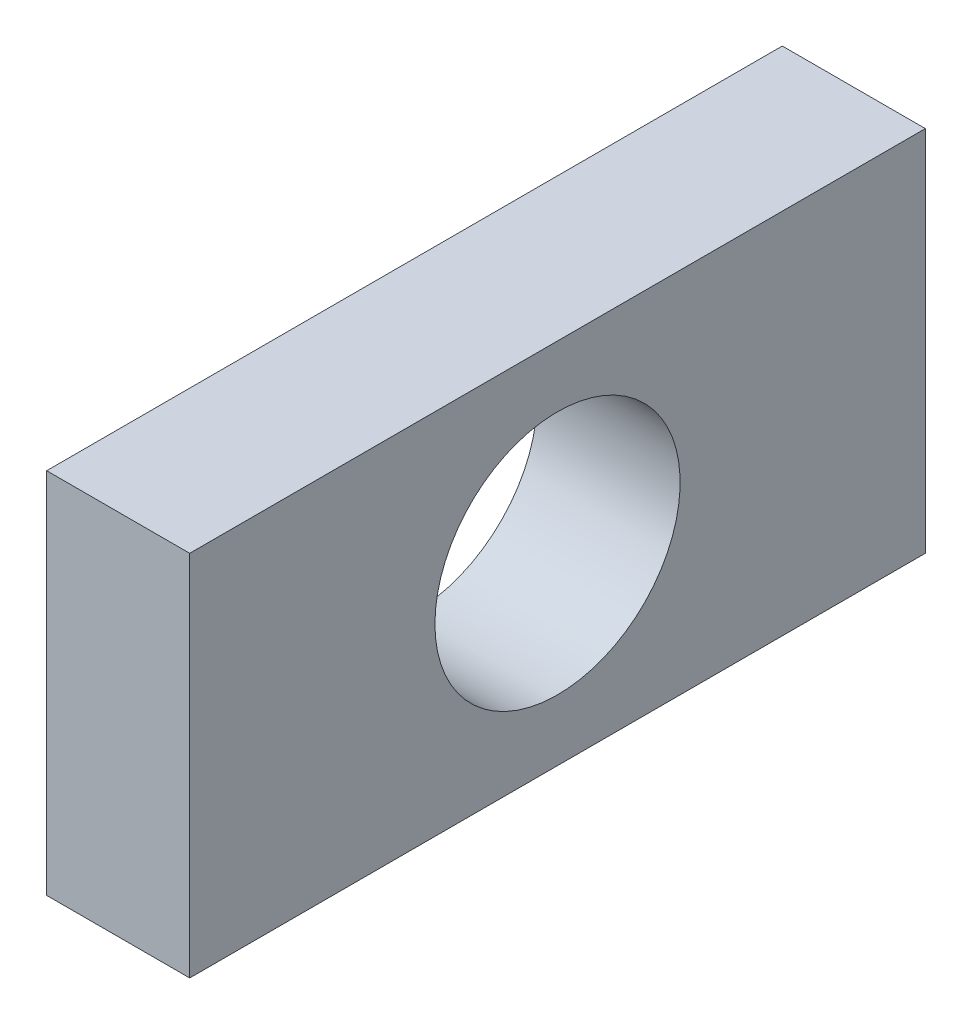
ISO-10303-21;
HEADER;
FILE_DESCRIPTION(('STEP AP214'),'2;1');
FILE_NAME('part.step','',(''),(''),'','','');
FILE_SCHEMA(('AUTOMOTIVE_DESIGN { 1 0 10303 214 1 1 1 1 }'));
ENDSEC;
DATA;
#1=APPLICATION_CONTEXT('core data for automotive mechanical design processes');
#2=APPLICATION_PROTOCOL_DEFINITION('international standard','automotive_design',2000,#1);
#3=PRODUCT_CONTEXT('',#1,'mechanical');
#4=PRODUCT('Part','Part','',(#3));
#5=PRODUCT_RELATED_PRODUCT_CATEGORY('part','',(#4));
#6=PRODUCT_DEFINITION_FORMATION('','',#4);
#7=PRODUCT_DEFINITION_CONTEXT('part definition',#1,'design');
#8=PRODUCT_DEFINITION('design','',#6,#7);
#9=PRODUCT_DEFINITION_SHAPE('','',#8);
#10=(LENGTH_UNIT() NAMED_UNIT(*) SI_UNIT(.MILLI.,.METRE.));
#11=(NAMED_UNIT(*) PLANE_ANGLE_UNIT() SI_UNIT($,.RADIAN.));
#12=(NAMED_UNIT(*) SI_UNIT($,.STERADIAN.) SOLID_ANGLE_UNIT());
#13=UNCERTAINTY_MEASURE_WITH_UNIT(LENGTH_MEASURE(1.E-05),#10,'distance_accuracy_value','');
#14=(GEOMETRIC_REPRESENTATION_CONTEXT(3) GLOBAL_UNCERTAINTY_ASSIGNED_CONTEXT((#13)) GLOBAL_UNIT_ASSIGNED_CONTEXT((#10,
#11,#12)) REPRESENTATION_CONTEXT('',''));
#15=CARTESIAN_POINT('',(0.,0.,0.));
#16=DIRECTION('',(0.,0.,1.));
#17=DIRECTION('',(1.,0.,0.));
#18=AXIS2_PLACEMENT_3D('',#15,#16,#17);
#19=CARTESIAN_POINT('',(11.1125,0.,0.));
#20=DIRECTION('',(0.,1.,0.));
#21=DIRECTION('',(0.,0.,1.));
#22=AXIS2_PLACEMENT_3D('',#19,#20,#21);
#23=PLANE('',#22);
#24=DIRECTION('',(0.,0.,-1.));
#25=VECTOR('',#24,1.);
#26=CARTESIAN_POINT('',(0.,0.,0.));
#27=LINE('',#26,#25);
#28=CARTESIAN_POINT('',(0.,0.,0.));
#29=VERTEX_POINT('',#28);
#30=CARTESIAN_POINT('',(0.,0.,-57.15));
#31=VERTEX_POINT('',#30);
#32=EDGE_CURVE('E96',#29,#31,#27,.T.);
#33=ORIENTED_EDGE('',*,*,#32,.T.);
#34=DIRECTION('',(-1.,0.,0.));
#35=VECTOR('',#34,1.);
#36=CARTESIAN_POINT('',(11.1125,0.,-57.15));
#37=LINE('',#36,#35);
#38=CARTESIAN_POINT('',(11.1125,0.,-57.15));
#39=VERTEX_POINT('',#38);
#40=EDGE_CURVE('E11',#39,#31,#37,.T.);
#41=ORIENTED_EDGE('',*,*,#40,.F.);
#42=DIRECTION('',(0.,0.,-1.));
#43=VECTOR('',#42,1.);
#44=CARTESIAN_POINT('',(11.1125,0.,0.));
#45=LINE('',#44,#43);
#46=CARTESIAN_POINT('',(11.1125,0.,0.));
#47=VERTEX_POINT('',#46);
#48=EDGE_CURVE('E82',#47,#39,#45,.T.);
#49=ORIENTED_EDGE('',*,*,#48,.F.);
#50=DIRECTION('',(-1.,0.,0.));
#51=VECTOR('',#50,1.);
#52=CARTESIAN_POINT('',(11.1125,0.,0.));
#53=LINE('',#52,#51);
#54=EDGE_CURVE('E49',#47,#29,#53,.T.);
#55=ORIENTED_EDGE('',*,*,#54,.T.);
#56=EDGE_LOOP('',(#33,#41,#49,#55));
#57=FACE_BOUND('',#56,.T.);
#58=ADVANCED_FACE('F33',(#57),#23,.F.);
#59=CARTESIAN_POINT('',(11.1125,0.,-57.15));
#60=DIRECTION('',(0.,0.,1.));
#61=DIRECTION('',(1.,0.,0.));
#62=AXIS2_PLACEMENT_3D('',#59,#60,#61);
#63=PLANE('',#62);
#64=DIRECTION('',(0.,1.,0.));
#65=VECTOR('',#64,1.);
#66=CARTESIAN_POINT('',(0.,0.,-57.15));
#67=LINE('',#66,#65);
#68=CARTESIAN_POINT('',(0.,28.575,-57.15));
#69=VERTEX_POINT('',#68);
#70=EDGE_CURVE('E87',#31,#69,#67,.T.);
#71=ORIENTED_EDGE('',*,*,#70,.T.);
#72=DIRECTION('',(-1.,0.,0.));
#73=VECTOR('',#72,1.);
#74=CARTESIAN_POINT('',(11.1125,28.575,-57.15));
#75=LINE('',#74,#73);
#76=CARTESIAN_POINT('',(11.1125,28.575,-57.15));
#77=VERTEX_POINT('',#76);
#78=EDGE_CURVE('E41',#77,#69,#75,.T.);
#79=ORIENTED_EDGE('',*,*,#78,.F.);
#80=DIRECTION('',(0.,1.,0.));
#81=VECTOR('',#80,1.);
#82=CARTESIAN_POINT('',(11.1125,0.,-57.15));
#83=LINE('',#82,#81);
#84=EDGE_CURVE('E74',#39,#77,#83,.T.);
#85=ORIENTED_EDGE('',*,*,#84,.F.);
#86=ORIENTED_EDGE('',*,*,#40,.T.);
#87=EDGE_LOOP('',(#71,#79,#85,#86));
#88=FACE_BOUND('',#87,.T.);
#89=ADVANCED_FACE('F86',(#88),#63,.F.);
#90=CARTESIAN_POINT('',(11.1125,28.575,0.));
#91=DIRECTION('',(0.,1.,0.));
#92=DIRECTION('',(0.,0.,1.));
#93=AXIS2_PLACEMENT_3D('',#90,#91,#92);
#94=PLANE('',#93);
#95=DIRECTION('',(0.,0.,-1.));
#96=VECTOR('',#95,1.);
#97=CARTESIAN_POINT('',(0.,28.575,0.));
#98=LINE('',#97,#96);
#99=CARTESIAN_POINT('',(0.,28.575,0.));
#100=VERTEX_POINT('',#99);
#101=EDGE_CURVE('E100',#100,#69,#98,.T.);
#102=ORIENTED_EDGE('',*,*,#101,.F.);
#103=DIRECTION('',(-1.,0.,0.));
#104=VECTOR('',#103,1.);
#105=CARTESIAN_POINT('',(11.1125,28.575,0.));
#106=LINE('',#105,#104);
#107=CARTESIAN_POINT('',(11.1125,28.575,0.));
#108=VERTEX_POINT('',#107);
#109=EDGE_CURVE('E63',#108,#100,#106,.T.);
#110=ORIENTED_EDGE('',*,*,#109,.F.);
#111=DIRECTION('',(0.,0.,-1.));
#112=VECTOR('',#111,1.);
#113=CARTESIAN_POINT('',(11.1125,28.575,0.));
#114=LINE('',#113,#112);
#115=EDGE_CURVE('E81',#108,#77,#114,.T.);
#116=ORIENTED_EDGE('',*,*,#115,.T.);
#117=ORIENTED_EDGE('',*,*,#78,.T.);
#118=EDGE_LOOP('',(#102,#110,#116,#117));
#119=FACE_BOUND('',#118,.T.);
#120=ADVANCED_FACE('F90',(#119),#94,.T.);
#121=CARTESIAN_POINT('',(11.1125,0.,0.));
#122=DIRECTION('',(0.,0.,1.));
#123=DIRECTION('',(1.,0.,0.));
#124=AXIS2_PLACEMENT_3D('',#121,#122,#123);
#125=PLANE('',#124);
#126=DIRECTION('',(0.,1.,0.));
#127=VECTOR('',#126,1.);
#128=CARTESIAN_POINT('',(0.,0.,0.));
#129=LINE('',#128,#127);
#130=EDGE_CURVE('E102',#29,#100,#129,.T.);
#131=ORIENTED_EDGE('',*,*,#130,.F.);
#132=ORIENTED_EDGE('',*,*,#54,.F.);
#133=DIRECTION('',(0.,1.,0.));
#134=VECTOR('',#133,1.);
#135=CARTESIAN_POINT('',(11.1125,0.,0.));
#136=LINE('',#135,#134);
#137=EDGE_CURVE('E91',#47,#108,#136,.T.);
#138=ORIENTED_EDGE('',*,*,#137,.T.);
#139=ORIENTED_EDGE('',*,*,#109,.T.);
#140=EDGE_LOOP('',(#131,#132,#138,#139));
#141=FACE_BOUND('',#140,.T.);
#142=ADVANCED_FACE('F124',(#141),#125,.T.);
#143=CARTESIAN_POINT('',(11.1125,0.,0.));
#144=DIRECTION('',(1.,0.,0.));
#145=DIRECTION('',(0.,0.,-1.));
#146=AXIS2_PLACEMENT_3D('',#143,#144,#145);
#147=PLANE('',#146);
#148=CARTESIAN_POINT('',(11.1125,14.2875,-28.575));
#149=DIRECTION('',(-1.,0.,0.));
#150=DIRECTION('',(0.,0.,1.));
#151=AXIS2_PLACEMENT_3D('',#148,#149,#150);
#152=CIRCLE('',#151,9.525);
#153=CARTESIAN_POINT('',(11.1125,14.2875,-19.05));
#154=VERTEX_POINT('',#153);
#155=EDGE_CURVE('E98',#154,#154,#152,.T.);
#156=ORIENTED_EDGE('',*,*,#155,.T.);
#157=EDGE_LOOP('',(#156));
#158=FACE_BOUND('',#157,.T.);
#159=ORIENTED_EDGE('',*,*,#48,.T.);
#160=ORIENTED_EDGE('',*,*,#84,.T.);
#161=ORIENTED_EDGE('',*,*,#115,.F.);
#162=ORIENTED_EDGE('',*,*,#137,.F.);
#163=EDGE_LOOP('',(#159,#160,#161,#162));
#164=FACE_BOUND('',#163,.T.);
#165=ADVANCED_FACE('F78',(#158,#164),#147,.T.);
#166=CARTESIAN_POINT('',(0.,0.,0.));
#167=DIRECTION('',(1.,0.,0.));
#168=DIRECTION('',(0.,0.,-1.));
#169=AXIS2_PLACEMENT_3D('',#166,#167,#168);
#170=PLANE('',#169);
#171=CARTESIAN_POINT('',(0.,14.2875,-28.575));
#172=DIRECTION('',(-1.,0.,0.));
#173=DIRECTION('',(0.,0.,1.));
#174=AXIS2_PLACEMENT_3D('',#171,#172,#173);
#175=CIRCLE('',#174,9.525);
#176=CARTESIAN_POINT('',(0.,14.2875,-19.05));
#177=VERTEX_POINT('',#176);
#178=EDGE_CURVE('E108',#177,#177,#175,.T.);
#179=ORIENTED_EDGE('',*,*,#178,.F.);
#180=EDGE_LOOP('',(#179));
#181=FACE_BOUND('',#180,.T.);
#182=ORIENTED_EDGE('',*,*,#32,.F.);
#183=ORIENTED_EDGE('',*,*,#130,.T.);
#184=ORIENTED_EDGE('',*,*,#101,.T.);
#185=ORIENTED_EDGE('',*,*,#70,.F.);
#186=EDGE_LOOP('',(#182,#183,#184,#185));
#187=FACE_BOUND('',#186,.T.);
#188=ADVANCED_FACE('F118',(#181,#187),#170,.F.);
#189=CARTESIAN_POINT('',(11.1125,14.2875,-28.575));
#190=DIRECTION('',(-1.,0.,0.));
#191=DIRECTION('',(0.,0.,1.));
#192=AXIS2_PLACEMENT_3D('',#189,#190,#191);
#193=CYLINDRICAL_SURFACE('',#192,9.525);
#194=ORIENTED_EDGE('',*,*,#155,.F.);
#195=EDGE_LOOP('',(#194));
#196=FACE_BOUND('',#195,.T.);
#197=ORIENTED_EDGE('',*,*,#178,.T.);
#198=EDGE_LOOP('',(#197));
#199=FACE_BOUND('',#198,.T.);
#200=ADVANCED_FACE('F115',(#196,#199),#193,.F.);
#201=CLOSED_SHELL('',(#58,#89,#120,#142,#165,#188,#200));
#202=MANIFOLD_SOLID_BREP('B2',#201);
#203=ADVANCED_BREP_SHAPE_REPRESENTATION('',(#18,#202),#14);
#204=SHAPE_DEFINITION_REPRESENTATION(#9,#203);
ENDSEC;
END-ISO-10303-21;
